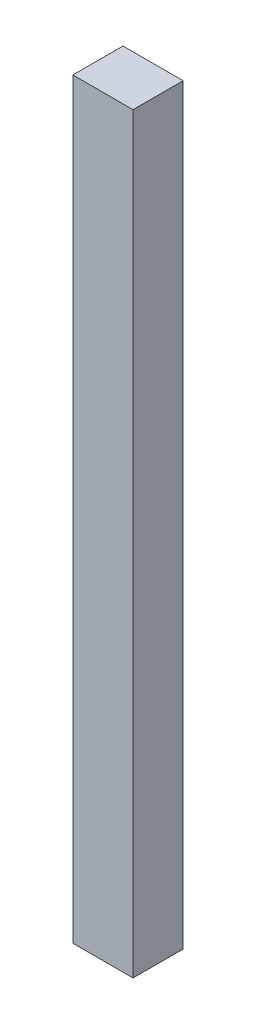
ISO-10303-21;
HEADER;
FILE_DESCRIPTION(('STEP AP214'),'2;1');
FILE_NAME('part.step','',(''),(''),'','','');
FILE_SCHEMA(('AUTOMOTIVE_DESIGN { 1 0 10303 214 1 1 1 1 }'));
ENDSEC;
DATA;
#1=APPLICATION_CONTEXT('core data for automotive mechanical design processes');
#2=APPLICATION_PROTOCOL_DEFINITION('international standard','automotive_design',2000,#1);
#3=PRODUCT_CONTEXT('',#1,'mechanical');
#4=PRODUCT('Part','Part','',(#3));
#5=PRODUCT_RELATED_PRODUCT_CATEGORY('part','',(#4));
#6=PRODUCT_DEFINITION_FORMATION('','',#4);
#7=PRODUCT_DEFINITION_CONTEXT('part definition',#1,'design');
#8=PRODUCT_DEFINITION('design','',#6,#7);
#9=PRODUCT_DEFINITION_SHAPE('','',#8);
#10=(LENGTH_UNIT() NAMED_UNIT(*) SI_UNIT(.MILLI.,.METRE.));
#11=(NAMED_UNIT(*) PLANE_ANGLE_UNIT() SI_UNIT($,.RADIAN.));
#12=(NAMED_UNIT(*) SI_UNIT($,.STERADIAN.) SOLID_ANGLE_UNIT());
#13=UNCERTAINTY_MEASURE_WITH_UNIT(LENGTH_MEASURE(1.E-05),#10,'distance_accuracy_value','');
#14=(GEOMETRIC_REPRESENTATION_CONTEXT(3) GLOBAL_UNCERTAINTY_ASSIGNED_CONTEXT((#13)) GLOBAL_UNIT_ASSIGNED_CONTEXT((#10,
#11,#12)) REPRESENTATION_CONTEXT('',''));
#15=CARTESIAN_POINT('',(0.,0.,0.));
#16=DIRECTION('',(0.,0.,1.));
#17=DIRECTION('',(1.,0.,0.));
#18=AXIS2_PLACEMENT_3D('',#15,#16,#17);
#19=CARTESIAN_POINT('',(1.524,38.1,1.27));
#20=DIRECTION('',(-1.,0.,0.));
#21=DIRECTION('',(0.,0.,1.));
#22=AXIS2_PLACEMENT_3D('',#19,#20,#21);
#23=PLANE('',#22);
#24=DIRECTION('',(0.,0.,-1.));
#25=VECTOR('',#24,1.);
#26=CARTESIAN_POINT('',(1.524,0.,1.26999999999999));
#27=LINE('',#26,#25);
#28=CARTESIAN_POINT('',(1.524,0.,1.26999999999999));
#29=VERTEX_POINT('',#28);
#30=CARTESIAN_POINT('',(1.524,0.,-1.27000000000001));
#31=VERTEX_POINT('',#30);
#32=EDGE_CURVE('E97',#29,#31,#27,.T.);
#33=ORIENTED_EDGE('',*,*,#32,.T.);
#34=DIRECTION('',(0.,-1.,0.));
#35=VECTOR('',#34,1.);
#36=CARTESIAN_POINT('',(1.524,38.1,-1.27000000000001));
#37=LINE('',#36,#35);
#38=CARTESIAN_POINT('',(1.524,38.1,-1.27000000000001));
#39=VERTEX_POINT('',#38);
#40=EDGE_CURVE('E11',#39,#31,#37,.T.);
#41=ORIENTED_EDGE('',*,*,#40,.F.);
#42=DIRECTION('',(0.,0.,-1.));
#43=VECTOR('',#42,1.);
#44=CARTESIAN_POINT('',(1.524,38.1,1.27));
#45=LINE('',#44,#43);
#46=CARTESIAN_POINT('',(1.524,38.1,1.27));
#47=VERTEX_POINT('',#46);
#48=EDGE_CURVE('E85',#47,#39,#45,.T.);
#49=ORIENTED_EDGE('',*,*,#48,.F.);
#50=DIRECTION('',(0.,-1.,0.));
#51=VECTOR('',#50,1.);
#52=CARTESIAN_POINT('',(1.524,38.1,1.27));
#53=LINE('',#52,#51);
#54=EDGE_CURVE('E93',#47,#29,#53,.T.);
#55=ORIENTED_EDGE('',*,*,#54,.T.);
#56=EDGE_LOOP('',(#33,#41,#49,#55));
#57=FACE_BOUND('',#56,.T.);
#58=ADVANCED_FACE('F34',(#57),#23,.F.);
#59=CARTESIAN_POINT('',(-1.524,38.1,-1.27000000000001));
#60=DIRECTION('',(0.,0.,1.));
#61=DIRECTION('',(1.,0.,0.));
#62=AXIS2_PLACEMENT_3D('',#59,#60,#61);
#63=PLANE('',#62);
#64=DIRECTION('',(-1.,0.,0.));
#65=VECTOR('',#64,1.);
#66=CARTESIAN_POINT('',(-1.524,0.,-1.27000000000001));
#67=LINE('',#66,#65);
#68=CARTESIAN_POINT('',(-1.524,0.,-1.27000000000001));
#69=VERTEX_POINT('',#68);
#70=EDGE_CURVE('E89',#31,#69,#67,.T.);
#71=ORIENTED_EDGE('',*,*,#70,.T.);
#72=DIRECTION('',(0.,-1.,0.));
#73=VECTOR('',#72,1.);
#74=CARTESIAN_POINT('',(-1.524,38.1,-1.27000000000001));
#75=LINE('',#74,#73);
#76=CARTESIAN_POINT('',(-1.524,38.1,-1.27000000000001));
#77=VERTEX_POINT('',#76);
#78=EDGE_CURVE('E42',#77,#69,#75,.T.);
#79=ORIENTED_EDGE('',*,*,#78,.F.);
#80=DIRECTION('',(-1.,0.,0.));
#81=VECTOR('',#80,1.);
#82=CARTESIAN_POINT('',(-1.524,38.1,-1.27000000000001));
#83=LINE('',#82,#81);
#84=EDGE_CURVE('E80',#39,#77,#83,.T.);
#85=ORIENTED_EDGE('',*,*,#84,.F.);
#86=ORIENTED_EDGE('',*,*,#40,.T.);
#87=EDGE_LOOP('',(#71,#79,#85,#86));
#88=FACE_BOUND('',#87,.T.);
#89=ADVANCED_FACE('F88',(#88),#63,.F.);
#90=CARTESIAN_POINT('',(-1.524,38.1,1.26999999999999));
#91=DIRECTION('',(1.,0.,0.));
#92=DIRECTION('',(0.,0.,-1.));
#93=AXIS2_PLACEMENT_3D('',#90,#91,#92);
#94=PLANE('',#93);
#95=DIRECTION('',(0.,0.,1.));
#96=VECTOR('',#95,1.);
#97=CARTESIAN_POINT('',(-1.524,0.,1.26999999999999));
#98=LINE('',#97,#96);
#99=CARTESIAN_POINT('',(-1.524,0.,1.26999999999999));
#100=VERTEX_POINT('',#99);
#101=EDGE_CURVE('E67',#69,#100,#98,.T.);
#102=ORIENTED_EDGE('',*,*,#101,.T.);
#103=DIRECTION('',(0.,-1.,0.));
#104=VECTOR('',#103,1.);
#105=CARTESIAN_POINT('',(-1.524,38.1,1.26999999999999));
#106=LINE('',#105,#104);
#107=CARTESIAN_POINT('',(-1.524,38.1,1.26999999999999));
#108=VERTEX_POINT('',#107);
#109=EDGE_CURVE('E90',#108,#100,#106,.T.);
#110=ORIENTED_EDGE('',*,*,#109,.F.);
#111=DIRECTION('',(0.,0.,1.));
#112=VECTOR('',#111,1.);
#113=CARTESIAN_POINT('',(-1.524,38.1,1.26999999999999));
#114=LINE('',#113,#112);
#115=EDGE_CURVE('E83',#77,#108,#114,.T.);
#116=ORIENTED_EDGE('',*,*,#115,.F.);
#117=ORIENTED_EDGE('',*,*,#78,.T.);
#118=EDGE_LOOP('',(#102,#110,#116,#117));
#119=FACE_BOUND('',#118,.T.);
#120=ADVANCED_FACE('F91',(#119),#94,.F.);
#121=CARTESIAN_POINT('',(-1.524,38.1,1.26999999999999));
#122=DIRECTION('',(0.,0.,-1.));
#123=DIRECTION('',(-1.,0.,0.));
#124=AXIS2_PLACEMENT_3D('',#121,#122,#123);
#125=PLANE('',#124);
#126=DIRECTION('',(1.,0.,0.));
#127=VECTOR('',#126,1.);
#128=CARTESIAN_POINT('',(-1.524,0.,1.26999999999999));
#129=LINE('',#128,#127);
#130=EDGE_CURVE('E73',#100,#29,#129,.T.);
#131=ORIENTED_EDGE('',*,*,#130,.T.);
#132=ORIENTED_EDGE('',*,*,#54,.F.);
#133=DIRECTION('',(1.,0.,0.));
#134=VECTOR('',#133,1.);
#135=CARTESIAN_POINT('',(-1.524,38.1,1.26999999999999));
#136=LINE('',#135,#134);
#137=EDGE_CURVE('E50',#108,#47,#136,.T.);
#138=ORIENTED_EDGE('',*,*,#137,.F.);
#139=ORIENTED_EDGE('',*,*,#109,.T.);
#140=EDGE_LOOP('',(#131,#132,#138,#139));
#141=FACE_BOUND('',#140,.T.);
#142=ADVANCED_FACE('F104',(#141),#125,.F.);
#143=CARTESIAN_POINT('',(0.,38.1,0.));
#144=DIRECTION('',(0.,-1.,0.));
#145=DIRECTION('',(0.,0.,-1.));
#146=AXIS2_PLACEMENT_3D('',#143,#144,#145);
#147=PLANE('',#146);
#148=ORIENTED_EDGE('',*,*,#48,.T.);
#149=ORIENTED_EDGE('',*,*,#84,.T.);
#150=ORIENTED_EDGE('',*,*,#115,.T.);
#151=ORIENTED_EDGE('',*,*,#137,.T.);
#152=EDGE_LOOP('',(#148,#149,#150,#151));
#153=FACE_BOUND('',#152,.T.);
#154=ADVANCED_FACE('F81',(#153),#147,.F.);
#155=CARTESIAN_POINT('',(0.,0.,0.));
#156=DIRECTION('',(0.,-1.,0.));
#157=DIRECTION('',(0.,0.,-1.));
#158=AXIS2_PLACEMENT_3D('',#155,#156,#157);
#159=PLANE('',#158);
#160=ORIENTED_EDGE('',*,*,#32,.F.);
#161=ORIENTED_EDGE('',*,*,#130,.F.);
#162=ORIENTED_EDGE('',*,*,#101,.F.);
#163=ORIENTED_EDGE('',*,*,#70,.F.);
#164=EDGE_LOOP('',(#160,#161,#162,#163));
#165=FACE_BOUND('',#164,.T.);
#166=ADVANCED_FACE('F107',(#165),#159,.T.);
#167=CLOSED_SHELL('',(#58,#89,#120,#142,#154,#166));
#168=MANIFOLD_SOLID_BREP('B2',#167);
#169=ADVANCED_BREP_SHAPE_REPRESENTATION('',(#18,#168),#14);
#170=SHAPE_DEFINITION_REPRESENTATION(#9,#169);
ENDSEC;
END-ISO-10303-21;
